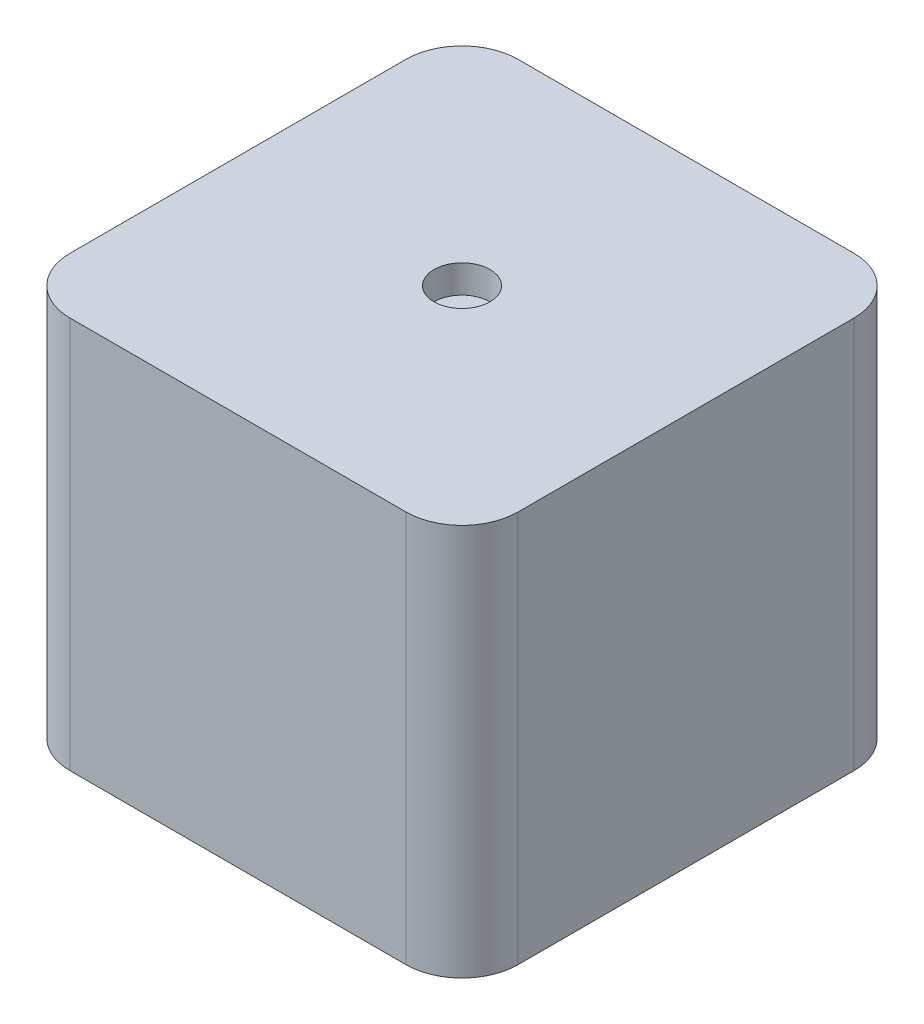
ISO-10303-21;
HEADER;
FILE_DESCRIPTION(('STEP AP214'),'2;1');
FILE_NAME('part.step','',(''),(''),'','','');
FILE_SCHEMA(('AUTOMOTIVE_DESIGN { 1 0 10303 214 1 1 1 1 }'));
ENDSEC;
DATA;
#1=APPLICATION_CONTEXT('core data for automotive mechanical design processes');
#2=APPLICATION_PROTOCOL_DEFINITION('international standard','automotive_design',2000,#1);
#3=PRODUCT_CONTEXT('',#1,'mechanical');
#4=PRODUCT('Part','Part','',(#3));
#5=PRODUCT_RELATED_PRODUCT_CATEGORY('part','',(#4));
#6=PRODUCT_DEFINITION_FORMATION('','',#4);
#7=PRODUCT_DEFINITION_CONTEXT('part definition',#1,'design');
#8=PRODUCT_DEFINITION('design','',#6,#7);
#9=PRODUCT_DEFINITION_SHAPE('','',#8);
#10=(LENGTH_UNIT() NAMED_UNIT(*) SI_UNIT(.MILLI.,.METRE.));
#11=(NAMED_UNIT(*) PLANE_ANGLE_UNIT() SI_UNIT($,.RADIAN.));
#12=(NAMED_UNIT(*) SI_UNIT($,.STERADIAN.) SOLID_ANGLE_UNIT());
#13=UNCERTAINTY_MEASURE_WITH_UNIT(LENGTH_MEASURE(1.E-05),#10,'distance_accuracy_value','');
#14=(GEOMETRIC_REPRESENTATION_CONTEXT(3) GLOBAL_UNCERTAINTY_ASSIGNED_CONTEXT((#13)) GLOBAL_UNIT_ASSIGNED_CONTEXT((#10,
#11,#12)) REPRESENTATION_CONTEXT('',''));
#15=CARTESIAN_POINT('',(0.,0.,0.));
#16=DIRECTION('',(0.,0.,1.));
#17=DIRECTION('',(1.,0.,0.));
#18=AXIS2_PLACEMENT_3D('',#15,#16,#17);
#19=CARTESIAN_POINT('',(-30.,70.,30.));
#20=DIRECTION('',(0.,-1.,0.));
#21=DIRECTION('',(0.,0.,-1.));
#22=AXIS2_PLACEMENT_3D('',#19,#20,#21);
#23=CYLINDRICAL_SURFACE('',#22,10.);
#24=CARTESIAN_POINT('',(-30.,0.,30.));
#25=DIRECTION('',(0.,1.,0.));
#26=DIRECTION('',(0.,0.,-1.));
#27=AXIS2_PLACEMENT_3D('',#24,#25,#26);
#28=CIRCLE('',#27,10.);
#29=CARTESIAN_POINT('',(-40.,0.,29.9999999999999));
#30=VERTEX_POINT('',#29);
#31=CARTESIAN_POINT('',(-29.9999999999999,0.,40.));
#32=VERTEX_POINT('',#31);
#33=EDGE_CURVE('E134',#30,#32,#28,.T.);
#34=ORIENTED_EDGE('',*,*,#33,.T.);
#35=DIRECTION('',(0.,-1.,0.));
#36=VECTOR('',#35,1.);
#37=CARTESIAN_POINT('',(-29.9999999999999,70.,40.));
#38=LINE('',#37,#36);
#39=CARTESIAN_POINT('',(-29.9999999999999,70.,40.));
#40=VERTEX_POINT('',#39);
#41=EDGE_CURVE('E11',#40,#32,#38,.T.);
#42=ORIENTED_EDGE('',*,*,#41,.F.);
#43=CARTESIAN_POINT('',(-30.,70.,30.));
#44=DIRECTION('',(0.,1.,0.));
#45=DIRECTION('',(0.,0.,-1.));
#46=AXIS2_PLACEMENT_3D('',#43,#44,#45);
#47=CIRCLE('',#46,10.);
#48=CARTESIAN_POINT('',(-40.,70.,29.9999999999999));
#49=VERTEX_POINT('',#48);
#50=EDGE_CURVE('E148',#49,#40,#47,.T.);
#51=ORIENTED_EDGE('',*,*,#50,.F.);
#52=DIRECTION('',(0.,-1.,0.));
#53=VECTOR('',#52,1.);
#54=CARTESIAN_POINT('',(-40.,70.,29.9999999999999));
#55=LINE('',#54,#53);
#56=EDGE_CURVE('E131',#49,#30,#55,.T.);
#57=ORIENTED_EDGE('',*,*,#56,.T.);
#58=EDGE_LOOP('',(#34,#42,#51,#57));
#59=FACE_BOUND('',#58,.T.);
#60=ADVANCED_FACE('F39',(#59),#23,.T.);
#61=CARTESIAN_POINT('',(-29.9999999999999,70.,40.));
#62=DIRECTION('',(0.,0.,-1.));
#63=DIRECTION('',(-1.,0.,0.));
#64=AXIS2_PLACEMENT_3D('',#61,#62,#63);
#65=PLANE('',#64);
#66=DIRECTION('',(1.,0.,0.));
#67=VECTOR('',#66,1.);
#68=CARTESIAN_POINT('',(-29.9999999999999,0.,40.));
#69=LINE('',#68,#67);
#70=CARTESIAN_POINT('',(29.9999999999999,0.,40.));
#71=VERTEX_POINT('',#70);
#72=EDGE_CURVE('E138',#32,#71,#69,.T.);
#73=ORIENTED_EDGE('',*,*,#72,.T.);
#74=DIRECTION('',(0.,-1.,0.));
#75=VECTOR('',#74,1.);
#76=CARTESIAN_POINT('',(29.9999999999999,70.,40.));
#77=LINE('',#76,#75);
#78=CARTESIAN_POINT('',(29.9999999999999,70.,40.));
#79=VERTEX_POINT('',#78);
#80=EDGE_CURVE('E50',#79,#71,#77,.T.);
#81=ORIENTED_EDGE('',*,*,#80,.F.);
#82=DIRECTION('',(1.,0.,0.));
#83=VECTOR('',#82,1.);
#84=CARTESIAN_POINT('',(-29.9999999999999,70.,40.));
#85=LINE('',#84,#83);
#86=EDGE_CURVE('E97',#40,#79,#85,.T.);
#87=ORIENTED_EDGE('',*,*,#86,.F.);
#88=ORIENTED_EDGE('',*,*,#41,.T.);
#89=EDGE_LOOP('',(#73,#81,#87,#88));
#90=FACE_BOUND('',#89,.T.);
#91=ADVANCED_FACE('F210',(#90),#65,.F.);
#92=CARTESIAN_POINT('',(30.,70.,30.));
#93=DIRECTION('',(0.,-1.,0.));
#94=DIRECTION('',(0.,0.,-1.));
#95=AXIS2_PLACEMENT_3D('',#92,#93,#94);
#96=CYLINDRICAL_SURFACE('',#95,10.);
#97=CARTESIAN_POINT('',(30.,0.,30.));
#98=DIRECTION('',(0.,1.,0.));
#99=DIRECTION('',(0.,0.,1.));
#100=AXIS2_PLACEMENT_3D('',#97,#98,#99);
#101=CIRCLE('',#100,10.);
#102=CARTESIAN_POINT('',(40.,0.,29.9999999999999));
#103=VERTEX_POINT('',#102);
#104=EDGE_CURVE('E141',#71,#103,#101,.T.);
#105=ORIENTED_EDGE('',*,*,#104,.T.);
#106=DIRECTION('',(0.,-1.,0.));
#107=VECTOR('',#106,1.);
#108=CARTESIAN_POINT('',(40.,70.,29.9999999999999));
#109=LINE('',#108,#107);
#110=CARTESIAN_POINT('',(40.,70.,29.9999999999999));
#111=VERTEX_POINT('',#110);
#112=EDGE_CURVE('E160',#111,#103,#109,.T.);
#113=ORIENTED_EDGE('',*,*,#112,.F.);
#114=CARTESIAN_POINT('',(30.,70.,30.));
#115=DIRECTION('',(0.,1.,0.));
#116=DIRECTION('',(0.,0.,1.));
#117=AXIS2_PLACEMENT_3D('',#114,#115,#116);
#118=CIRCLE('',#117,10.);
#119=EDGE_CURVE('E164',#79,#111,#118,.T.);
#120=ORIENTED_EDGE('',*,*,#119,.F.);
#121=ORIENTED_EDGE('',*,*,#80,.T.);
#122=EDGE_LOOP('',(#105,#113,#120,#121));
#123=FACE_BOUND('',#122,.T.);
#124=ADVANCED_FACE('F161',(#123),#96,.T.);
#125=CARTESIAN_POINT('',(40.,70.,29.9999999999999));
#126=DIRECTION('',(-1.,0.,0.));
#127=DIRECTION('',(0.,0.,1.));
#128=AXIS2_PLACEMENT_3D('',#125,#126,#127);
#129=PLANE('',#128);
#130=DIRECTION('',(0.,0.,-1.));
#131=VECTOR('',#130,1.);
#132=CARTESIAN_POINT('',(40.,0.,29.9999999999999));
#133=LINE('',#132,#131);
#134=CARTESIAN_POINT('',(40.,0.,-29.9999999999999));
#135=VERTEX_POINT('',#134);
#136=EDGE_CURVE('E142',#103,#135,#133,.T.);
#137=ORIENTED_EDGE('',*,*,#136,.T.);
#138=DIRECTION('',(0.,-1.,0.));
#139=VECTOR('',#138,1.);
#140=CARTESIAN_POINT('',(40.,70.,-29.9999999999999));
#141=LINE('',#140,#139);
#142=CARTESIAN_POINT('',(40.,70.,-29.9999999999999));
#143=VERTEX_POINT('',#142);
#144=EDGE_CURVE('E152',#143,#135,#141,.T.);
#145=ORIENTED_EDGE('',*,*,#144,.F.);
#146=DIRECTION('',(0.,0.,-1.));
#147=VECTOR('',#146,1.);
#148=CARTESIAN_POINT('',(40.,70.,29.9999999999999));
#149=LINE('',#148,#147);
#150=EDGE_CURVE('E180',#111,#143,#149,.T.);
#151=ORIENTED_EDGE('',*,*,#150,.F.);
#152=ORIENTED_EDGE('',*,*,#112,.T.);
#153=EDGE_LOOP('',(#137,#145,#151,#152));
#154=FACE_BOUND('',#153,.T.);
#155=ADVANCED_FACE('F171',(#154),#129,.F.);
#156=CARTESIAN_POINT('',(30.,70.,-30.));
#157=DIRECTION('',(0.,-1.,0.));
#158=DIRECTION('',(0.,0.,-1.));
#159=AXIS2_PLACEMENT_3D('',#156,#157,#158);
#160=CYLINDRICAL_SURFACE('',#159,10.);
#161=CARTESIAN_POINT('',(30.,0.,-30.));
#162=DIRECTION('',(0.,1.,0.));
#163=DIRECTION('',(0.,0.,-1.));
#164=AXIS2_PLACEMENT_3D('',#161,#162,#163);
#165=CIRCLE('',#164,10.);
#166=CARTESIAN_POINT('',(29.9999999999999,0.,-40.));
#167=VERTEX_POINT('',#166);
#168=EDGE_CURVE('E144',#135,#167,#165,.T.);
#169=ORIENTED_EDGE('',*,*,#168,.T.);
#170=DIRECTION('',(0.,-1.,0.));
#171=VECTOR('',#170,1.);
#172=CARTESIAN_POINT('',(29.9999999999999,70.,-40.));
#173=LINE('',#172,#171);
#174=CARTESIAN_POINT('',(29.9999999999999,70.,-40.));
#175=VERTEX_POINT('',#174);
#176=EDGE_CURVE('E128',#175,#167,#173,.T.);
#177=ORIENTED_EDGE('',*,*,#176,.F.);
#178=CARTESIAN_POINT('',(30.,70.,-30.));
#179=DIRECTION('',(0.,1.,0.));
#180=DIRECTION('',(0.,0.,-1.));
#181=AXIS2_PLACEMENT_3D('',#178,#179,#180);
#182=CIRCLE('',#181,10.);
#183=EDGE_CURVE('E120',#143,#175,#182,.T.);
#184=ORIENTED_EDGE('',*,*,#183,.F.);
#185=ORIENTED_EDGE('',*,*,#144,.T.);
#186=EDGE_LOOP('',(#169,#177,#184,#185));
#187=FACE_BOUND('',#186,.T.);
#188=ADVANCED_FACE('F176',(#187),#160,.T.);
#189=CARTESIAN_POINT('',(-29.9999999999999,70.,-40.));
#190=DIRECTION('',(0.,0.,1.));
#191=DIRECTION('',(1.,0.,0.));
#192=AXIS2_PLACEMENT_3D('',#189,#190,#191);
#193=PLANE('',#192);
#194=DIRECTION('',(-1.,0.,0.));
#195=VECTOR('',#194,1.);
#196=CARTESIAN_POINT('',(-29.9999999999999,0.,-40.));
#197=LINE('',#196,#195);
#198=CARTESIAN_POINT('',(-29.9999999999999,0.,-40.));
#199=VERTEX_POINT('',#198);
#200=EDGE_CURVE('E124',#167,#199,#197,.T.);
#201=ORIENTED_EDGE('',*,*,#200,.T.);
#202=DIRECTION('',(0.,-1.,0.));
#203=VECTOR('',#202,1.);
#204=CARTESIAN_POINT('',(-29.9999999999999,70.,-40.));
#205=LINE('',#204,#203);
#206=CARTESIAN_POINT('',(-29.9999999999999,70.,-40.));
#207=VERTEX_POINT('',#206);
#208=EDGE_CURVE('E122',#207,#199,#205,.T.);
#209=ORIENTED_EDGE('',*,*,#208,.F.);
#210=DIRECTION('',(-1.,0.,0.));
#211=VECTOR('',#210,1.);
#212=CARTESIAN_POINT('',(-29.9999999999999,70.,-40.));
#213=LINE('',#212,#211);
#214=EDGE_CURVE('E112',#175,#207,#213,.T.);
#215=ORIENTED_EDGE('',*,*,#214,.F.);
#216=ORIENTED_EDGE('',*,*,#176,.T.);
#217=EDGE_LOOP('',(#201,#209,#215,#216));
#218=FACE_BOUND('',#217,.T.);
#219=ADVANCED_FACE('F121',(#218),#193,.F.);
#220=CARTESIAN_POINT('',(-30.,70.,-30.));
#221=DIRECTION('',(0.,-1.,0.));
#222=DIRECTION('',(0.,0.,-1.));
#223=AXIS2_PLACEMENT_3D('',#220,#221,#222);
#224=CYLINDRICAL_SURFACE('',#223,10.);
#225=CARTESIAN_POINT('',(-30.,0.,-30.));
#226=DIRECTION('',(0.,1.,0.));
#227=DIRECTION('',(0.,0.,-1.));
#228=AXIS2_PLACEMENT_3D('',#225,#226,#227);
#229=CIRCLE('',#228,10.);
#230=CARTESIAN_POINT('',(-40.,0.,-29.9999999999999));
#231=VERTEX_POINT('',#230);
#232=EDGE_CURVE('E84',#199,#231,#229,.T.);
#233=ORIENTED_EDGE('',*,*,#232,.T.);
#234=DIRECTION('',(0.,-1.,0.));
#235=VECTOR('',#234,1.);
#236=CARTESIAN_POINT('',(-40.,70.,-29.9999999999999));
#237=LINE('',#236,#235);
#238=CARTESIAN_POINT('',(-40.,70.,-29.9999999999999));
#239=VERTEX_POINT('',#238);
#240=EDGE_CURVE('E130',#239,#231,#237,.T.);
#241=ORIENTED_EDGE('',*,*,#240,.F.);
#242=CARTESIAN_POINT('',(-30.,70.,-30.));
#243=DIRECTION('',(0.,1.,0.));
#244=DIRECTION('',(0.,0.,-1.));
#245=AXIS2_PLACEMENT_3D('',#242,#243,#244);
#246=CIRCLE('',#245,10.);
#247=EDGE_CURVE('E113',#207,#239,#246,.T.);
#248=ORIENTED_EDGE('',*,*,#247,.F.);
#249=ORIENTED_EDGE('',*,*,#208,.T.);
#250=EDGE_LOOP('',(#233,#241,#248,#249));
#251=FACE_BOUND('',#250,.T.);
#252=ADVANCED_FACE('F129',(#251),#224,.T.);
#253=CARTESIAN_POINT('',(-40.,70.,29.9999999999999));
#254=DIRECTION('',(1.,0.,0.));
#255=DIRECTION('',(0.,0.,-1.));
#256=AXIS2_PLACEMENT_3D('',#253,#254,#255);
#257=PLANE('',#256);
#258=DIRECTION('',(0.,0.,1.));
#259=VECTOR('',#258,1.);
#260=CARTESIAN_POINT('',(-40.,0.,29.9999999999999));
#261=LINE('',#260,#259);
#262=EDGE_CURVE('E89',#231,#30,#261,.T.);
#263=ORIENTED_EDGE('',*,*,#262,.T.);
#264=ORIENTED_EDGE('',*,*,#56,.F.);
#265=DIRECTION('',(0.,0.,1.));
#266=VECTOR('',#265,1.);
#267=CARTESIAN_POINT('',(-40.,70.,29.9999999999999));
#268=LINE('',#267,#266);
#269=EDGE_CURVE('E54',#239,#49,#268,.T.);
#270=ORIENTED_EDGE('',*,*,#269,.F.);
#271=ORIENTED_EDGE('',*,*,#240,.T.);
#272=EDGE_LOOP('',(#263,#264,#270,#271));
#273=FACE_BOUND('',#272,.T.);
#274=ADVANCED_FACE('F196',(#273),#257,.F.);
#275=CARTESIAN_POINT('',(-30.,70.,30.));
#276=DIRECTION('',(0.,-1.,0.));
#277=DIRECTION('',(0.,0.,-1.));
#278=AXIS2_PLACEMENT_3D('',#275,#276,#277);
#279=PLANE('',#278);
#280=CARTESIAN_POINT('',(0.,70.,0.));
#281=DIRECTION('',(0.,1.,0.));
#282=DIRECTION('',(0.,0.,1.));
#283=AXIS2_PLACEMENT_3D('',#280,#281,#282);
#284=CIRCLE('',#283,5.);
#285=CARTESIAN_POINT('',(0.,70.,5.));
#286=VERTEX_POINT('',#285);
#287=EDGE_CURVE('E183',#286,#286,#284,.T.);
#288=ORIENTED_EDGE('',*,*,#287,.F.);
#289=EDGE_LOOP('',(#288));
#290=FACE_BOUND('',#289,.T.);
#291=ORIENTED_EDGE('',*,*,#50,.T.);
#292=ORIENTED_EDGE('',*,*,#86,.T.);
#293=ORIENTED_EDGE('',*,*,#119,.T.);
#294=ORIENTED_EDGE('',*,*,#150,.T.);
#295=ORIENTED_EDGE('',*,*,#183,.T.);
#296=ORIENTED_EDGE('',*,*,#214,.T.);
#297=ORIENTED_EDGE('',*,*,#247,.T.);
#298=ORIENTED_EDGE('',*,*,#269,.T.);
#299=EDGE_LOOP('',(#291,#292,#293,#294,#295,#296,#297,#298));
#300=FACE_BOUND('',#299,.T.);
#301=ADVANCED_FACE('F111',(#290,#300),#279,.F.);
#302=CARTESIAN_POINT('',(-30.,0.,30.));
#303=DIRECTION('',(0.,-1.,0.));
#304=DIRECTION('',(0.,0.,-1.));
#305=AXIS2_PLACEMENT_3D('',#302,#303,#304);
#306=PLANE('',#305);
#307=ORIENTED_EDGE('',*,*,#33,.F.);
#308=ORIENTED_EDGE('',*,*,#262,.F.);
#309=ORIENTED_EDGE('',*,*,#232,.F.);
#310=ORIENTED_EDGE('',*,*,#200,.F.);
#311=ORIENTED_EDGE('',*,*,#168,.F.);
#312=ORIENTED_EDGE('',*,*,#136,.F.);
#313=ORIENTED_EDGE('',*,*,#104,.F.);
#314=ORIENTED_EDGE('',*,*,#72,.F.);
#315=EDGE_LOOP('',(#307,#308,#309,#310,#311,#312,#313,#314));
#316=FACE_BOUND('',#315,.T.);
#317=ADVANCED_FACE('F170',(#316),#306,.T.);
#318=CARTESIAN_POINT('',(0.,65.,0.));
#319=DIRECTION('',(0.,1.,0.));
#320=DIRECTION('',(0.,0.,1.));
#321=AXIS2_PLACEMENT_3D('',#318,#319,#320);
#322=CYLINDRICAL_SURFACE('',#321,5.);
#323=CARTESIAN_POINT('',(0.,65.,0.));
#324=DIRECTION('',(0.,1.,0.));
#325=DIRECTION('',(0.,0.,1.));
#326=AXIS2_PLACEMENT_3D('',#323,#324,#325);
#327=CIRCLE('',#326,5.);
#328=CARTESIAN_POINT('',(0.,65.,5.));
#329=VERTEX_POINT('',#328);
#330=EDGE_CURVE('E137',#329,#329,#327,.T.);
#331=ORIENTED_EDGE('',*,*,#330,.F.);
#332=EDGE_LOOP('',(#331));
#333=FACE_BOUND('',#332,.T.);
#334=ORIENTED_EDGE('',*,*,#287,.T.);
#335=EDGE_LOOP('',(#334));
#336=FACE_BOUND('',#335,.T.);
#337=ADVANCED_FACE('F192',(#333,#336),#322,.F.);
#338=CARTESIAN_POINT('',(0.,65.,0.));
#339=DIRECTION('',(0.,1.,0.));
#340=DIRECTION('',(0.,0.,1.));
#341=AXIS2_PLACEMENT_3D('',#338,#339,#340);
#342=PLANE('',#341);
#343=ORIENTED_EDGE('',*,*,#330,.T.);
#344=EDGE_LOOP('',(#343));
#345=FACE_BOUND('',#344,.T.);
#346=ADVANCED_FACE('F188',(#345),#342,.T.);
#347=CLOSED_SHELL('',(#60,#91,#124,#155,#188,#219,#252,#274,#301,#317,#337,#346));
#348=MANIFOLD_SOLID_BREP('B2',#347);
#349=ADVANCED_BREP_SHAPE_REPRESENTATION('',(#18,#348),#14);
#350=SHAPE_DEFINITION_REPRESENTATION(#9,#349);
ENDSEC;
END-ISO-10303-21;
